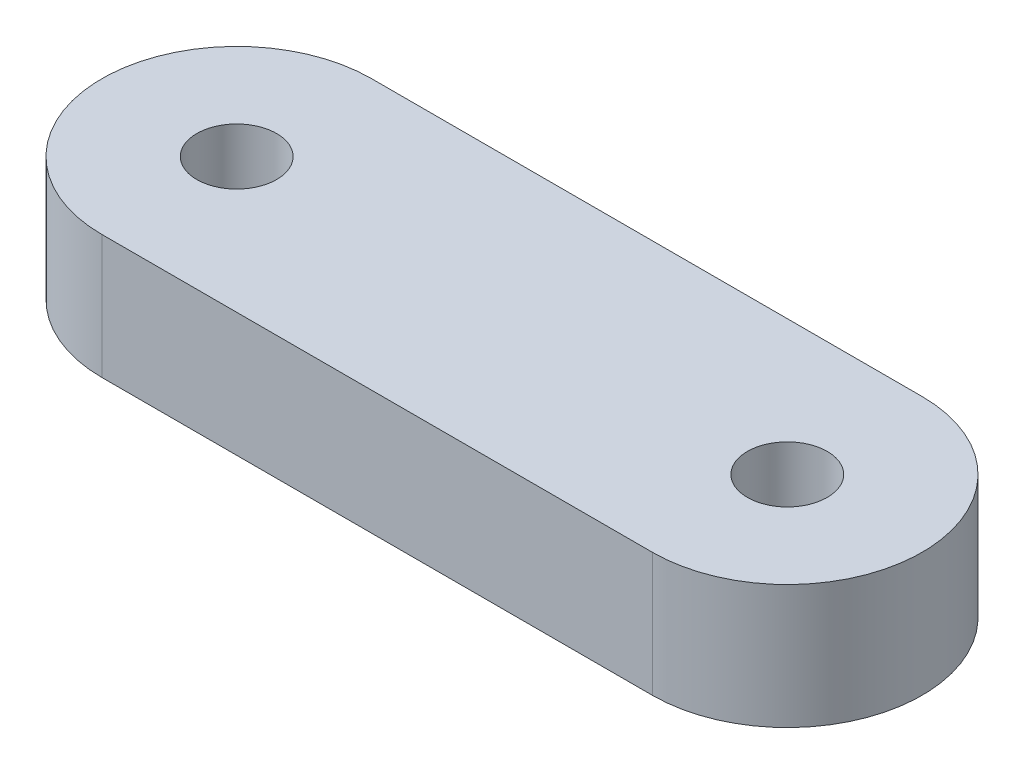
ISO-10303-21;
HEADER;
FILE_DESCRIPTION(('STEP AP214'),'2;1');
FILE_NAME('part.step','',(''),(''),'','','');
FILE_SCHEMA(('AUTOMOTIVE_DESIGN { 1 0 10303 214 1 1 1 1 }'));
ENDSEC;
DATA;
#1=APPLICATION_CONTEXT('core data for automotive mechanical design processes');
#2=APPLICATION_PROTOCOL_DEFINITION('international standard','automotive_design',2000,#1);
#3=PRODUCT_CONTEXT('',#1,'mechanical');
#4=PRODUCT('Part','Part','',(#3));
#5=PRODUCT_RELATED_PRODUCT_CATEGORY('part','',(#4));
#6=PRODUCT_DEFINITION_FORMATION('','',#4);
#7=PRODUCT_DEFINITION_CONTEXT('part definition',#1,'design');
#8=PRODUCT_DEFINITION('design','',#6,#7);
#9=PRODUCT_DEFINITION_SHAPE('','',#8);
#10=(LENGTH_UNIT() NAMED_UNIT(*) SI_UNIT(.MILLI.,.METRE.));
#11=(NAMED_UNIT(*) PLANE_ANGLE_UNIT() SI_UNIT($,.RADIAN.));
#12=(NAMED_UNIT(*) SI_UNIT($,.STERADIAN.) SOLID_ANGLE_UNIT());
#13=UNCERTAINTY_MEASURE_WITH_UNIT(LENGTH_MEASURE(1.E-05),#10,'distance_accuracy_value','');
#14=(GEOMETRIC_REPRESENTATION_CONTEXT(3) GLOBAL_UNCERTAINTY_ASSIGNED_CONTEXT((#13)) GLOBAL_UNIT_ASSIGNED_CONTEXT((#10,
#11,#12)) REPRESENTATION_CONTEXT('',''));
#15=CARTESIAN_POINT('',(0.,0.,0.));
#16=DIRECTION('',(0.,0.,1.));
#17=DIRECTION('',(1.,0.,0.));
#18=AXIS2_PLACEMENT_3D('',#15,#16,#17);
#19=CARTESIAN_POINT('',(10.,4.5,0.));
#20=DIRECTION('',(0.,1.,0.));
#21=DIRECTION('',(0.,0.,1.));
#22=AXIS2_PLACEMENT_3D('',#19,#20,#21);
#23=PLANE('',#22);
#24=CARTESIAN_POINT('',(-10.,4.5,0.));
#25=DIRECTION('',(0.,1.,0.));
#26=DIRECTION('',(0.,0.,1.));
#27=AXIS2_PLACEMENT_3D('',#24,#25,#26);
#28=CIRCLE('',#27,1.45);
#29=CARTESIAN_POINT('',(-10.,4.5,1.45));
#30=VERTEX_POINT('',#29);
#31=EDGE_CURVE('E100',#30,#30,#28,.T.);
#32=ORIENTED_EDGE('',*,*,#31,.F.);
#33=EDGE_LOOP('',(#32));
#34=FACE_BOUND('',#33,.T.);
#35=CARTESIAN_POINT('',(10.,4.5,0.));
#36=DIRECTION('',(0.,1.,0.));
#37=DIRECTION('',(0.,0.,1.));
#38=AXIS2_PLACEMENT_3D('',#35,#36,#37);
#39=CIRCLE('',#38,4.90000000000001);
#40=CARTESIAN_POINT('',(10.0000002409626,4.5,4.9));
#41=VERTEX_POINT('',#40);
#42=CARTESIAN_POINT('',(10.0000002409626,4.5,-4.9));
#43=VERTEX_POINT('',#42);
#44=EDGE_CURVE('E85',#41,#43,#39,.T.);
#45=ORIENTED_EDGE('',*,*,#44,.T.);
#46=DIRECTION('',(-1.,0.,0.));
#47=VECTOR('',#46,1.);
#48=CARTESIAN_POINT('',(-10.0000002409626,4.5,-4.9));
#49=LINE('',#48,#47);
#50=CARTESIAN_POINT('',(-10.0000002409626,4.5,-4.9));
#51=VERTEX_POINT('',#50);
#52=EDGE_CURVE('E80',#43,#51,#49,.T.);
#53=ORIENTED_EDGE('',*,*,#52,.T.);
#54=CARTESIAN_POINT('',(-10.,4.5,0.));
#55=DIRECTION('',(0.,1.,0.));
#56=DIRECTION('',(0.,0.,1.));
#57=AXIS2_PLACEMENT_3D('',#54,#55,#56);
#58=CIRCLE('',#57,4.90000000000001);
#59=CARTESIAN_POINT('',(-10.0000002409626,4.5,4.9));
#60=VERTEX_POINT('',#59);
#61=EDGE_CURVE('E83',#51,#60,#58,.T.);
#62=ORIENTED_EDGE('',*,*,#61,.T.);
#63=DIRECTION('',(1.,0.,0.));
#64=VECTOR('',#63,1.);
#65=CARTESIAN_POINT('',(-10.0000002409626,4.5,4.9));
#66=LINE('',#65,#64);
#67=EDGE_CURVE('E50',#60,#41,#66,.T.);
#68=ORIENTED_EDGE('',*,*,#67,.T.);
#69=EDGE_LOOP('',(#45,#53,#62,#68));
#70=FACE_BOUND('',#69,.T.);
#71=CARTESIAN_POINT('',(10.,4.5,0.));
#72=DIRECTION('',(0.,1.,0.));
#73=DIRECTION('',(0.,0.,-1.));
#74=AXIS2_PLACEMENT_3D('',#71,#72,#73);
#75=CIRCLE('',#74,1.45);
#76=CARTESIAN_POINT('',(10.,4.5,-1.45));
#77=VERTEX_POINT('',#76);
#78=EDGE_CURVE('E115',#77,#77,#75,.T.);
#79=ORIENTED_EDGE('',*,*,#78,.F.);
#80=EDGE_LOOP('',(#79));
#81=FACE_BOUND('',#80,.T.);
#82=ADVANCED_FACE('F33',(#34,#70,#81),#23,.T.);
#83=CARTESIAN_POINT('',(10.,0.,0.));
#84=DIRECTION('',(0.,1.,0.));
#85=DIRECTION('',(0.,0.,1.));
#86=AXIS2_PLACEMENT_3D('',#83,#84,#85);
#87=PLANE('',#86);
#88=CARTESIAN_POINT('',(10.,0.,0.));
#89=DIRECTION('',(0.,1.,0.));
#90=DIRECTION('',(0.,0.,1.));
#91=AXIS2_PLACEMENT_3D('',#88,#89,#90);
#92=CIRCLE('',#91,4.90000000000001);
#93=CARTESIAN_POINT('',(10.0000002409626,0.,4.9));
#94=VERTEX_POINT('',#93);
#95=CARTESIAN_POINT('',(10.0000002409626,0.,-4.9));
#96=VERTEX_POINT('',#95);
#97=EDGE_CURVE('E97',#94,#96,#92,.T.);
#98=ORIENTED_EDGE('',*,*,#97,.F.);
#99=DIRECTION('',(1.,0.,0.));
#100=VECTOR('',#99,1.);
#101=CARTESIAN_POINT('',(-10.0000002409626,0.,4.9));
#102=LINE('',#101,#100);
#103=CARTESIAN_POINT('',(-10.0000002409626,0.,4.9));
#104=VERTEX_POINT('',#103);
#105=EDGE_CURVE('E73',#104,#94,#102,.T.);
#106=ORIENTED_EDGE('',*,*,#105,.F.);
#107=CARTESIAN_POINT('',(-10.,0.,0.));
#108=DIRECTION('',(0.,1.,0.));
#109=DIRECTION('',(0.,0.,1.));
#110=AXIS2_PLACEMENT_3D('',#107,#108,#109);
#111=CIRCLE('',#110,4.90000000000001);
#112=CARTESIAN_POINT('',(-10.0000002409626,0.,-4.9));
#113=VERTEX_POINT('',#112);
#114=EDGE_CURVE('E67',#113,#104,#111,.T.);
#115=ORIENTED_EDGE('',*,*,#114,.F.);
#116=DIRECTION('',(-1.,0.,0.));
#117=VECTOR('',#116,1.);
#118=CARTESIAN_POINT('',(-10.0000002409626,0.,-4.9));
#119=LINE('',#118,#117);
#120=EDGE_CURVE('E89',#96,#113,#119,.T.);
#121=ORIENTED_EDGE('',*,*,#120,.F.);
#122=EDGE_LOOP('',(#98,#106,#115,#121));
#123=FACE_BOUND('',#122,.T.);
#124=CARTESIAN_POINT('',(-10.,0.,0.));
#125=DIRECTION('',(0.,1.,0.));
#126=DIRECTION('',(0.,0.,1.));
#127=AXIS2_PLACEMENT_3D('',#124,#125,#126);
#128=CIRCLE('',#127,1.45);
#129=CARTESIAN_POINT('',(-10.,0.,1.45));
#130=VERTEX_POINT('',#129);
#131=EDGE_CURVE('E112',#130,#130,#128,.T.);
#132=ORIENTED_EDGE('',*,*,#131,.T.);
#133=EDGE_LOOP('',(#132));
#134=FACE_BOUND('',#133,.T.);
#135=CARTESIAN_POINT('',(10.,0.,0.));
#136=DIRECTION('',(0.,1.,0.));
#137=DIRECTION('',(0.,0.,-1.));
#138=AXIS2_PLACEMENT_3D('',#135,#136,#137);
#139=CIRCLE('',#138,1.45);
#140=CARTESIAN_POINT('',(10.,0.,-1.45));
#141=VERTEX_POINT('',#140);
#142=EDGE_CURVE('E118',#141,#141,#139,.T.);
#143=ORIENTED_EDGE('',*,*,#142,.T.);
#144=EDGE_LOOP('',(#143));
#145=FACE_BOUND('',#144,.T.);
#146=ADVANCED_FACE('F108',(#123,#134,#145),#87,.F.);
#147=CARTESIAN_POINT('',(10.,4.5,0.));
#148=DIRECTION('',(0.,-1.,0.));
#149=DIRECTION('',(0.,0.,-1.));
#150=AXIS2_PLACEMENT_3D('',#147,#148,#149);
#151=CYLINDRICAL_SURFACE('',#150,4.90000000000001);
#152=ORIENTED_EDGE('',*,*,#97,.T.);
#153=DIRECTION('',(0.,-1.,0.));
#154=VECTOR('',#153,1.);
#155=CARTESIAN_POINT('',(10.0000002409626,4.5,-4.9));
#156=LINE('',#155,#154);
#157=EDGE_CURVE('E11',#43,#96,#156,.T.);
#158=ORIENTED_EDGE('',*,*,#157,.F.);
#159=ORIENTED_EDGE('',*,*,#44,.F.);
#160=DIRECTION('',(0.,-1.,0.));
#161=VECTOR('',#160,1.);
#162=CARTESIAN_POINT('',(10.0000002409626,4.5,4.9));
#163=LINE('',#162,#161);
#164=EDGE_CURVE('E93',#41,#94,#163,.T.);
#165=ORIENTED_EDGE('',*,*,#164,.T.);
#166=EDGE_LOOP('',(#152,#158,#159,#165));
#167=FACE_BOUND('',#166,.T.);
#168=ADVANCED_FACE('F35',(#167),#151,.T.);
#169=CARTESIAN_POINT('',(-10.0000002409626,4.5,-4.9));
#170=DIRECTION('',(0.,0.,1.));
#171=DIRECTION('',(1.,0.,0.));
#172=AXIS2_PLACEMENT_3D('',#169,#170,#171);
#173=PLANE('',#172);
#174=ORIENTED_EDGE('',*,*,#120,.T.);
#175=DIRECTION('',(0.,-1.,0.));
#176=VECTOR('',#175,1.);
#177=CARTESIAN_POINT('',(-10.0000002409626,4.5,-4.9));
#178=LINE('',#177,#176);
#179=EDGE_CURVE('E42',#51,#113,#178,.T.);
#180=ORIENTED_EDGE('',*,*,#179,.F.);
#181=ORIENTED_EDGE('',*,*,#52,.F.);
#182=ORIENTED_EDGE('',*,*,#157,.T.);
#183=EDGE_LOOP('',(#174,#180,#181,#182));
#184=FACE_BOUND('',#183,.T.);
#185=ADVANCED_FACE('F88',(#184),#173,.F.);
#186=CARTESIAN_POINT('',(-10.,4.5,0.));
#187=DIRECTION('',(0.,-1.,0.));
#188=DIRECTION('',(0.,0.,-1.));
#189=AXIS2_PLACEMENT_3D('',#186,#187,#188);
#190=CYLINDRICAL_SURFACE('',#189,4.90000000000001);
#191=ORIENTED_EDGE('',*,*,#114,.T.);
#192=DIRECTION('',(0.,-1.,0.));
#193=VECTOR('',#192,1.);
#194=CARTESIAN_POINT('',(-10.0000002409626,4.5,4.9));
#195=LINE('',#194,#193);
#196=EDGE_CURVE('E90',#60,#104,#195,.T.);
#197=ORIENTED_EDGE('',*,*,#196,.F.);
#198=ORIENTED_EDGE('',*,*,#61,.F.);
#199=ORIENTED_EDGE('',*,*,#179,.T.);
#200=EDGE_LOOP('',(#191,#197,#198,#199));
#201=FACE_BOUND('',#200,.T.);
#202=ADVANCED_FACE('F91',(#201),#190,.T.);
#203=CARTESIAN_POINT('',(-10.0000002409626,4.5,4.9));
#204=DIRECTION('',(0.,0.,-1.));
#205=DIRECTION('',(-1.,0.,0.));
#206=AXIS2_PLACEMENT_3D('',#203,#204,#205);
#207=PLANE('',#206);
#208=ORIENTED_EDGE('',*,*,#105,.T.);
#209=ORIENTED_EDGE('',*,*,#164,.F.);
#210=ORIENTED_EDGE('',*,*,#67,.F.);
#211=ORIENTED_EDGE('',*,*,#196,.T.);
#212=EDGE_LOOP('',(#208,#209,#210,#211));
#213=FACE_BOUND('',#212,.T.);
#214=ADVANCED_FACE('F105',(#213),#207,.F.);
#215=CARTESIAN_POINT('',(-10.,4.5,0.));
#216=DIRECTION('',(0.,-1.,0.));
#217=DIRECTION('',(0.,0.,-1.));
#218=AXIS2_PLACEMENT_3D('',#215,#216,#217);
#219=CYLINDRICAL_SURFACE('',#218,1.45);
#220=ORIENTED_EDGE('',*,*,#31,.T.);
#221=EDGE_LOOP('',(#220));
#222=FACE_BOUND('',#221,.T.);
#223=ORIENTED_EDGE('',*,*,#131,.F.);
#224=EDGE_LOOP('',(#223));
#225=FACE_BOUND('',#224,.T.);
#226=ADVANCED_FACE('F135',(#222,#225),#219,.F.);
#227=CARTESIAN_POINT('',(10.,4.5,0.));
#228=DIRECTION('',(0.,-1.,0.));
#229=DIRECTION('',(0.,0.,-1.));
#230=AXIS2_PLACEMENT_3D('',#227,#228,#229);
#231=CYLINDRICAL_SURFACE('',#230,1.45);
#232=ORIENTED_EDGE('',*,*,#78,.T.);
#233=EDGE_LOOP('',(#232));
#234=FACE_BOUND('',#233,.T.);
#235=ORIENTED_EDGE('',*,*,#142,.F.);
#236=EDGE_LOOP('',(#235));
#237=FACE_BOUND('',#236,.T.);
#238=ADVANCED_FACE('F124',(#234,#237),#231,.F.);
#239=CLOSED_SHELL('',(#82,#146,#168,#185,#202,#214,#226,#238));
#240=MANIFOLD_SOLID_BREP('B2',#239);
#241=ADVANCED_BREP_SHAPE_REPRESENTATION('',(#18,#240),#14);
#242=SHAPE_DEFINITION_REPRESENTATION(#9,#241);
ENDSEC;
END-ISO-10303-21;
